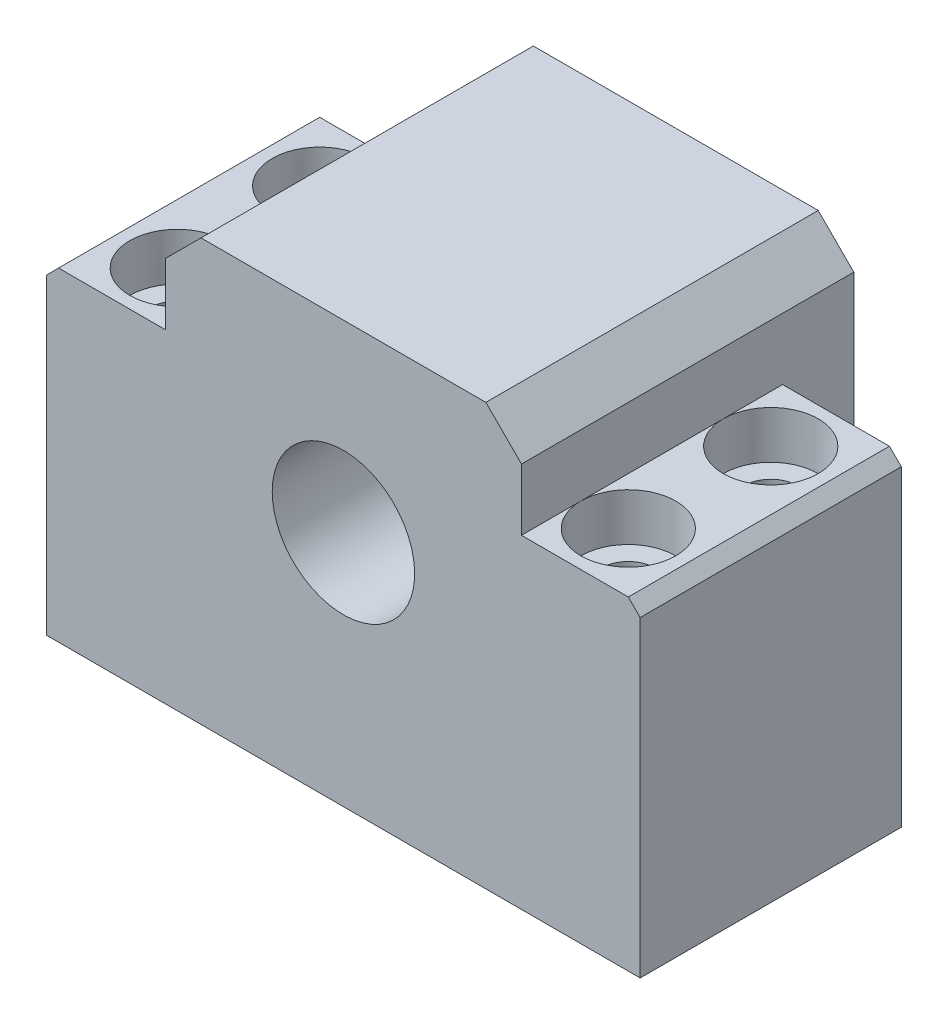
ISO-10303-21;
HEADER;
FILE_DESCRIPTION(('STEP AP214'),'2;1');
FILE_NAME('part.step','',(''),(''),'','','');
FILE_SCHEMA(('AUTOMOTIVE_DESIGN { 1 0 10303 214 1 1 1 1 }'));
ENDSEC;
DATA;
#1=APPLICATION_CONTEXT('core data for automotive mechanical design processes');
#2=APPLICATION_PROTOCOL_DEFINITION('international standard','automotive_design',2000,#1);
#3=PRODUCT_CONTEXT('',#1,'mechanical');
#4=PRODUCT('Part','Part','',(#3));
#5=PRODUCT_RELATED_PRODUCT_CATEGORY('part','',(#4));
#6=PRODUCT_DEFINITION_FORMATION('','',#4);
#7=PRODUCT_DEFINITION_CONTEXT('part definition',#1,'design');
#8=PRODUCT_DEFINITION('design','',#6,#7);
#9=PRODUCT_DEFINITION_SHAPE('','',#8);
#10=(LENGTH_UNIT() NAMED_UNIT(*) SI_UNIT(.MILLI.,.METRE.));
#11=(NAMED_UNIT(*) PLANE_ANGLE_UNIT() SI_UNIT($,.RADIAN.));
#12=(NAMED_UNIT(*) SI_UNIT($,.STERADIAN.) SOLID_ANGLE_UNIT());
#13=UNCERTAINTY_MEASURE_WITH_UNIT(LENGTH_MEASURE(1.E-05),#10,'distance_accuracy_value','');
#14=(GEOMETRIC_REPRESENTATION_CONTEXT(3) GLOBAL_UNCERTAINTY_ASSIGNED_CONTEXT((#13)) GLOBAL_UNIT_ASSIGNED_CONTEXT((#10,
#11,#12)) REPRESENTATION_CONTEXT('',''));
#15=CARTESIAN_POINT('',(0.,0.,0.));
#16=DIRECTION('',(0.,0.,1.));
#17=DIRECTION('',(1.,0.,0.));
#18=AXIS2_PLACEMENT_3D('',#15,#16,#17);
#19=CARTESIAN_POINT('',(0.,27.3,22.));
#20=DIRECTION('',(0.,-1.,0.));
#21=DIRECTION('',(0.,0.,-1.));
#22=AXIS2_PLACEMENT_3D('',#19,#20,#21);
#23=PLANE('',#22);
#24=DIRECTION('',(0.,0.,1.));
#25=VECTOR('',#24,1.);
#26=CARTESIAN_POINT('',(40.,27.3,22.));
#27=LINE('',#26,#25);
#28=CARTESIAN_POINT('',(40.,27.3,0.));
#29=VERTEX_POINT('',#28);
#30=CARTESIAN_POINT('',(40.,27.3,5.));
#31=VERTEX_POINT('',#30);
#32=EDGE_CURVE('E196',#29,#31,#27,.T.);
#33=ORIENTED_EDGE('',*,*,#32,.T.);
#34=CARTESIAN_POINT('',(44.,27.3,5.));
#35=DIRECTION('',(0.,1.,0.));
#36=DIRECTION('',(0.,0.,1.));
#37=AXIS2_PLACEMENT_3D('',#34,#35,#36);
#38=CIRCLE('',#37,4.);
#39=EDGE_CURVE('E54',#31,#31,#38,.T.);
#40=ORIENTED_EDGE('',*,*,#39,.F.);
#41=CARTESIAN_POINT('',(40.,27.3,17.));
#42=VERTEX_POINT('',#41);
#43=EDGE_CURVE('E60',#31,#42,#27,.T.);
#44=ORIENTED_EDGE('',*,*,#43,.T.);
#45=CARTESIAN_POINT('',(44.,27.3,17.));
#46=DIRECTION('',(0.,1.,0.));
#47=DIRECTION('',(0.,0.,1.));
#48=AXIS2_PLACEMENT_3D('',#45,#46,#47);
#49=CIRCLE('',#48,4.);
#50=EDGE_CURVE('E292',#42,#42,#49,.T.);
#51=ORIENTED_EDGE('',*,*,#50,.F.);
#52=CARTESIAN_POINT('',(40.,27.3,22.));
#53=VERTEX_POINT('',#52);
#54=EDGE_CURVE('E194',#42,#53,#27,.T.);
#55=ORIENTED_EDGE('',*,*,#54,.T.);
#56=DIRECTION('',(-1.,0.,0.));
#57=VECTOR('',#56,1.);
#58=CARTESIAN_POINT('',(0.,27.3,22.));
#59=LINE('',#58,#57);
#60=CARTESIAN_POINT('',(49.,27.3,22.));
#61=VERTEX_POINT('',#60);
#62=EDGE_CURVE('E214',#61,#53,#59,.T.);
#63=ORIENTED_EDGE('',*,*,#62,.F.);
#64=DIRECTION('',(0.,0.,-1.));
#65=VECTOR('',#64,1.);
#66=CARTESIAN_POINT('',(49.,27.3,22.));
#67=LINE('',#66,#65);
#68=CARTESIAN_POINT('',(49.,27.3,0.));
#69=VERTEX_POINT('',#68);
#70=EDGE_CURVE('E49',#61,#69,#67,.T.);
#71=ORIENTED_EDGE('',*,*,#70,.T.);
#72=DIRECTION('',(-1.,0.,0.));
#73=VECTOR('',#72,1.);
#74=CARTESIAN_POINT('',(0.,27.3,0.));
#75=LINE('',#74,#73);
#76=EDGE_CURVE('E208',#69,#29,#75,.T.);
#77=ORIENTED_EDGE('',*,*,#76,.T.);
#78=EDGE_LOOP('',(#33,#40,#44,#51,#55,#63,#71,#77));
#79=FACE_BOUND('',#78,.T.);
#80=ADVANCED_FACE('F41',(#79),#23,.F.);
#81=DIRECTION('',(0.,0.,-1.));
#82=VECTOR('',#81,1.);
#83=CARTESIAN_POINT('',(9.99999999999999,27.3,22.));
#84=LINE('',#83,#82);
#85=CARTESIAN_POINT('',(9.99999999999999,27.3,22.));
#86=VERTEX_POINT('',#85);
#87=CARTESIAN_POINT('',(9.99999999999999,27.3,17.));
#88=VERTEX_POINT('',#87);
#89=EDGE_CURVE('E200',#86,#88,#84,.T.);
#90=ORIENTED_EDGE('',*,*,#89,.T.);
#91=CARTESIAN_POINT('',(6.00000000000001,27.3,17.));
#92=DIRECTION('',(0.,1.,0.));
#93=DIRECTION('',(0.,0.,1.));
#94=AXIS2_PLACEMENT_3D('',#91,#92,#93);
#95=CIRCLE('',#94,3.99999999999999);
#96=EDGE_CURVE('E303',#88,#88,#95,.T.);
#97=ORIENTED_EDGE('',*,*,#96,.F.);
#98=CARTESIAN_POINT('',(9.99999999999999,27.3,5.));
#99=VERTEX_POINT('',#98);
#100=EDGE_CURVE('E204',#88,#99,#84,.T.);
#101=ORIENTED_EDGE('',*,*,#100,.T.);
#102=CARTESIAN_POINT('',(6.00000000000001,27.3,5.));
#103=DIRECTION('',(0.,1.,0.));
#104=DIRECTION('',(0.,0.,1.));
#105=AXIS2_PLACEMENT_3D('',#102,#103,#104);
#106=CIRCLE('',#105,3.99999999999999);
#107=EDGE_CURVE('E314',#99,#99,#106,.T.);
#108=ORIENTED_EDGE('',*,*,#107,.F.);
#109=CARTESIAN_POINT('',(9.99999999999999,27.3,0.));
#110=VERTEX_POINT('',#109);
#111=EDGE_CURVE('E199',#99,#110,#84,.T.);
#112=ORIENTED_EDGE('',*,*,#111,.T.);
#113=CARTESIAN_POINT('',(0.999999999999994,27.3,0.));
#114=VERTEX_POINT('',#113);
#115=EDGE_CURVE('E224',#110,#114,#75,.T.);
#116=ORIENTED_EDGE('',*,*,#115,.T.);
#117=DIRECTION('',(0.,0.,1.));
#118=VECTOR('',#117,1.);
#119=CARTESIAN_POINT('',(0.999999999999994,27.3,22.));
#120=LINE('',#119,#118);
#121=CARTESIAN_POINT('',(0.999999999999995,27.3,22.));
#122=VERTEX_POINT('',#121);
#123=EDGE_CURVE('E261',#114,#122,#120,.T.);
#124=ORIENTED_EDGE('',*,*,#123,.T.);
#125=EDGE_CURVE('E213',#86,#122,#59,.T.);
#126=ORIENTED_EDGE('',*,*,#125,.F.);
#127=EDGE_LOOP('',(#90,#97,#101,#108,#112,#116,#124,#126));
#128=FACE_BOUND('',#127,.T.);
#129=ADVANCED_FACE('F346',(#128),#23,.F.);
#130=CARTESIAN_POINT('',(0.,0.,22.));
#131=DIRECTION('',(1.,0.,0.));
#132=DIRECTION('',(0.,1.,0.));
#133=AXIS2_PLACEMENT_3D('',#130,#131,#132);
#134=PLANE('',#133);
#135=DIRECTION('',(0.,-1.,0.));
#136=VECTOR('',#135,1.);
#137=CARTESIAN_POINT('',(0.,0.,22.));
#138=LINE('',#137,#136);
#139=CARTESIAN_POINT('',(0.,26.3,22.));
#140=VERTEX_POINT('',#139);
#141=CARTESIAN_POINT('',(0.,0.,22.));
#142=VERTEX_POINT('',#141);
#143=EDGE_CURVE('E205',#140,#142,#138,.T.);
#144=ORIENTED_EDGE('',*,*,#143,.F.);
#145=DIRECTION('',(0.,0.,-1.));
#146=VECTOR('',#145,1.);
#147=CARTESIAN_POINT('',(0.,26.3,22.));
#148=LINE('',#147,#146);
#149=CARTESIAN_POINT('',(0.,26.3,0.));
#150=VERTEX_POINT('',#149);
#151=EDGE_CURVE('E254',#140,#150,#148,.T.);
#152=ORIENTED_EDGE('',*,*,#151,.T.);
#153=DIRECTION('',(0.,-1.,0.));
#154=VECTOR('',#153,1.);
#155=CARTESIAN_POINT('',(0.,0.,0.));
#156=LINE('',#155,#154);
#157=CARTESIAN_POINT('',(0.,0.,0.));
#158=VERTEX_POINT('',#157);
#159=EDGE_CURVE('E203',#150,#158,#156,.T.);
#160=ORIENTED_EDGE('',*,*,#159,.T.);
#161=DIRECTION('',(0.,0.,-1.));
#162=VECTOR('',#161,1.);
#163=CARTESIAN_POINT('',(0.,0.,22.));
#164=LINE('',#163,#162);
#165=EDGE_CURVE('E228',#142,#158,#164,.T.);
#166=ORIENTED_EDGE('',*,*,#165,.F.);
#167=EDGE_LOOP('',(#144,#152,#160,#166));
#168=FACE_BOUND('',#167,.T.);
#169=ADVANCED_FACE('F352',(#168),#134,.F.);
#170=CARTESIAN_POINT('',(0.,0.,22.));
#171=DIRECTION('',(0.,1.,0.));
#172=DIRECTION('',(0.,0.,1.));
#173=AXIS2_PLACEMENT_3D('',#170,#171,#172);
#174=PLANE('',#173);
#175=CARTESIAN_POINT('',(44.,0.,5.));
#176=DIRECTION('',(0.,1.,0.));
#177=DIRECTION('',(0.,0.,1.));
#178=AXIS2_PLACEMENT_3D('',#175,#176,#177);
#179=CIRCLE('',#178,2.25);
#180=CARTESIAN_POINT('',(44.,0.,7.24999999999999));
#181=VERTEX_POINT('',#180);
#182=EDGE_CURVE('E289',#181,#181,#179,.T.);
#183=ORIENTED_EDGE('',*,*,#182,.T.);
#184=EDGE_LOOP('',(#183));
#185=FACE_BOUND('',#184,.T.);
#186=CARTESIAN_POINT('',(44.,0.,17.));
#187=DIRECTION('',(0.,1.,0.));
#188=DIRECTION('',(0.,0.,1.));
#189=AXIS2_PLACEMENT_3D('',#186,#187,#188);
#190=CIRCLE('',#189,2.25);
#191=CARTESIAN_POINT('',(44.,0.,19.25));
#192=VERTEX_POINT('',#191);
#193=EDGE_CURVE('E300',#192,#192,#190,.T.);
#194=ORIENTED_EDGE('',*,*,#193,.T.);
#195=EDGE_LOOP('',(#194));
#196=FACE_BOUND('',#195,.T.);
#197=CARTESIAN_POINT('',(6.00000000000001,0.,17.));
#198=DIRECTION('',(0.,1.,0.));
#199=DIRECTION('',(0.,0.,1.));
#200=AXIS2_PLACEMENT_3D('',#197,#198,#199);
#201=CIRCLE('',#200,2.24999999999999);
#202=CARTESIAN_POINT('',(6.00000000000001,0.,19.25));
#203=VERTEX_POINT('',#202);
#204=EDGE_CURVE('E311',#203,#203,#201,.T.);
#205=ORIENTED_EDGE('',*,*,#204,.T.);
#206=EDGE_LOOP('',(#205));
#207=FACE_BOUND('',#206,.T.);
#208=CARTESIAN_POINT('',(6.00000000000001,0.,5.));
#209=DIRECTION('',(0.,1.,0.));
#210=DIRECTION('',(0.,0.,1.));
#211=AXIS2_PLACEMENT_3D('',#208,#209,#210);
#212=CIRCLE('',#211,2.24999999999999);
#213=CARTESIAN_POINT('',(6.00000000000001,0.,7.24999999999999));
#214=VERTEX_POINT('',#213);
#215=EDGE_CURVE('E323',#214,#214,#212,.T.);
#216=ORIENTED_EDGE('',*,*,#215,.T.);
#217=EDGE_LOOP('',(#216));
#218=FACE_BOUND('',#217,.T.);
#219=DIRECTION('',(1.,0.,0.));
#220=VECTOR('',#219,1.);
#221=CARTESIAN_POINT('',(0.,0.,0.));
#222=LINE('',#221,#220);
#223=CARTESIAN_POINT('',(50.,0.,0.));
#224=VERTEX_POINT('',#223);
#225=EDGE_CURVE('E219',#158,#224,#222,.T.);
#226=ORIENTED_EDGE('',*,*,#225,.T.);
#227=DIRECTION('',(0.,0.,-1.));
#228=VECTOR('',#227,1.);
#229=CARTESIAN_POINT('',(50.,0.,22.));
#230=LINE('',#229,#228);
#231=CARTESIAN_POINT('',(50.,0.,22.));
#232=VERTEX_POINT('',#231);
#233=EDGE_CURVE('E217',#232,#224,#230,.T.);
#234=ORIENTED_EDGE('',*,*,#233,.F.);
#235=DIRECTION('',(1.,0.,0.));
#236=VECTOR('',#235,1.);
#237=CARTESIAN_POINT('',(0.,0.,22.));
#238=LINE('',#237,#236);
#239=EDGE_CURVE('E207',#142,#232,#238,.T.);
#240=ORIENTED_EDGE('',*,*,#239,.F.);
#241=ORIENTED_EDGE('',*,*,#165,.T.);
#242=EDGE_LOOP('',(#226,#234,#240,#241));
#243=FACE_BOUND('',#242,.T.);
#244=ADVANCED_FACE('F361',(#185,#196,#207,#218,#243),#174,.F.);
#245=CARTESIAN_POINT('',(50.,0.,22.));
#246=DIRECTION('',(-1.,0.,0.));
#247=DIRECTION('',(0.,-1.,0.));
#248=AXIS2_PLACEMENT_3D('',#245,#246,#247);
#249=PLANE('',#248);
#250=DIRECTION('',(0.,1.,0.));
#251=VECTOR('',#250,1.);
#252=CARTESIAN_POINT('',(50.,0.,0.));
#253=LINE('',#252,#251);
#254=CARTESIAN_POINT('',(50.,26.3,0.));
#255=VERTEX_POINT('',#254);
#256=EDGE_CURVE('E221',#224,#255,#253,.T.);
#257=ORIENTED_EDGE('',*,*,#256,.T.);
#258=DIRECTION('',(0.,0.,1.));
#259=VECTOR('',#258,1.);
#260=CARTESIAN_POINT('',(50.,26.3,22.));
#261=LINE('',#260,#259);
#262=CARTESIAN_POINT('',(50.,26.3,22.));
#263=VERTEX_POINT('',#262);
#264=EDGE_CURVE('E11',#255,#263,#261,.T.);
#265=ORIENTED_EDGE('',*,*,#264,.T.);
#266=DIRECTION('',(0.,1.,0.));
#267=VECTOR('',#266,1.);
#268=CARTESIAN_POINT('',(50.,0.,22.));
#269=LINE('',#268,#267);
#270=EDGE_CURVE('E210',#232,#263,#269,.T.);
#271=ORIENTED_EDGE('',*,*,#270,.F.);
#272=ORIENTED_EDGE('',*,*,#233,.T.);
#273=EDGE_LOOP('',(#257,#265,#271,#272));
#274=FACE_BOUND('',#273,.T.);
#275=ADVANCED_FACE('F357',(#274),#249,.F.);
#276=CARTESIAN_POINT('',(0.,0.,22.));
#277=DIRECTION('',(0.,0.,-1.));
#278=DIRECTION('',(-1.,0.,0.));
#279=AXIS2_PLACEMENT_3D('',#276,#277,#278);
#280=PLANE('',#279);
#281=CARTESIAN_POINT('',(25.,20.,22.));
#282=DIRECTION('',(0.,0.,-1.));
#283=DIRECTION('',(-1.,0.,0.));
#284=AXIS2_PLACEMENT_3D('',#281,#282,#283);
#285=CIRCLE('',#284,6.);
#286=CARTESIAN_POINT('',(19.,20.,22.));
#287=VERTEX_POINT('',#286);
#288=EDGE_CURVE('E189',#287,#287,#285,.T.);
#289=ORIENTED_EDGE('',*,*,#288,.T.);
#290=EDGE_LOOP('',(#289));
#291=FACE_BOUND('',#290,.T.);
#292=ORIENTED_EDGE('',*,*,#125,.T.);
#293=DIRECTION('',(0.70710678118655,0.707106781186545,0.));
#294=VECTOR('',#293,1.);
#295=CARTESIAN_POINT('',(0.,26.3,22.));
#296=LINE('',#295,#294);
#297=EDGE_CURVE('E265',#122,#140,#296,.F.);
#298=ORIENTED_EDGE('',*,*,#297,.T.);
#299=ORIENTED_EDGE('',*,*,#143,.T.);
#300=ORIENTED_EDGE('',*,*,#239,.T.);
#301=ORIENTED_EDGE('',*,*,#270,.T.);
#302=DIRECTION('',(0.70710678118655,-0.707106781186545,0.));
#303=VECTOR('',#302,1.);
#304=CARTESIAN_POINT('',(49.,27.3,22.));
#305=LINE('',#304,#303);
#306=EDGE_CURVE('E263',#263,#61,#305,.F.);
#307=ORIENTED_EDGE('',*,*,#306,.T.);
#308=ORIENTED_EDGE('',*,*,#62,.T.);
#309=DIRECTION('',(0.,1.,0.));
#310=VECTOR('',#309,1.);
#311=CARTESIAN_POINT('',(40.,5.5,22.));
#312=LINE('',#311,#310);
#313=CARTESIAN_POINT('',(40.,32.5,22.));
#314=VERTEX_POINT('',#313);
#315=EDGE_CURVE('E188',#53,#314,#312,.T.);
#316=ORIENTED_EDGE('',*,*,#315,.T.);
#317=DIRECTION('',(0.707106781186549,-0.707106781186546,0.));
#318=VECTOR('',#317,1.);
#319=CARTESIAN_POINT('',(40.,32.5,22.));
#320=LINE('',#319,#318);
#321=CARTESIAN_POINT('',(37.,35.5,22.));
#322=VERTEX_POINT('',#321);
#323=EDGE_CURVE('E242',#314,#322,#320,.F.);
#324=ORIENTED_EDGE('',*,*,#323,.T.);
#325=DIRECTION('',(-1.,0.,0.));
#326=VECTOR('',#325,1.);
#327=CARTESIAN_POINT('',(9.99999999999999,35.5,22.));
#328=LINE('',#327,#326);
#329=CARTESIAN_POINT('',(13.,35.5,22.));
#330=VERTEX_POINT('',#329);
#331=EDGE_CURVE('E165',#322,#330,#328,.T.);
#332=ORIENTED_EDGE('',*,*,#331,.T.);
#333=DIRECTION('',(0.707106781186547,0.707106781186548,0.));
#334=VECTOR('',#333,1.);
#335=CARTESIAN_POINT('',(13.,35.5,22.));
#336=LINE('',#335,#334);
#337=CARTESIAN_POINT('',(9.99999999999999,32.5,22.));
#338=VERTEX_POINT('',#337);
#339=EDGE_CURVE('E244',#330,#338,#336,.F.);
#340=ORIENTED_EDGE('',*,*,#339,.T.);
#341=DIRECTION('',(0.,-1.,0.));
#342=VECTOR('',#341,1.);
#343=CARTESIAN_POINT('',(9.99999999999999,5.5,22.));
#344=LINE('',#343,#342);
#345=EDGE_CURVE('E186',#338,#86,#344,.T.);
#346=ORIENTED_EDGE('',*,*,#345,.T.);
#347=EDGE_LOOP('',(#292,#298,#299,#300,#301,#307,#308,#316,#324,#332,#340,#346));
#348=FACE_BOUND('',#347,.T.);
#349=ADVANCED_FACE('F360',(#291,#348),#280,.F.);
#350=CARTESIAN_POINT('',(0.,0.,0.));
#351=DIRECTION('',(0.,0.,-1.));
#352=DIRECTION('',(-1.,0.,0.));
#353=AXIS2_PLACEMENT_3D('',#350,#351,#352);
#354=PLANE('',#353);
#355=ORIENTED_EDGE('',*,*,#159,.F.);
#356=DIRECTION('',(-0.70710678118655,-0.707106781186545,0.));
#357=VECTOR('',#356,1.);
#358=CARTESIAN_POINT('',(-13.15,13.1500000000001,0.));
#359=LINE('',#358,#357);
#360=EDGE_CURVE('E259',#150,#114,#359,.F.);
#361=ORIENTED_EDGE('',*,*,#360,.T.);
#362=ORIENTED_EDGE('',*,*,#115,.F.);
#363=DIRECTION('',(0.,1.,0.));
#364=VECTOR('',#363,1.);
#365=CARTESIAN_POINT('',(9.99999999999999,0.,0.));
#366=LINE('',#365,#364);
#367=CARTESIAN_POINT('',(9.99999999999999,5.5,0.));
#368=VERTEX_POINT('',#367);
#369=EDGE_CURVE('E235',#368,#110,#366,.T.);
#370=ORIENTED_EDGE('',*,*,#369,.F.);
#371=DIRECTION('',(-1.,0.,0.));
#372=VECTOR('',#371,1.);
#373=CARTESIAN_POINT('',(0.,5.5,0.));
#374=LINE('',#373,#372);
#375=CARTESIAN_POINT('',(40.,5.5,0.));
#376=VERTEX_POINT('',#375);
#377=EDGE_CURVE('E172',#376,#368,#374,.T.);
#378=ORIENTED_EDGE('',*,*,#377,.F.);
#379=DIRECTION('',(0.,-1.,0.));
#380=VECTOR('',#379,1.);
#381=CARTESIAN_POINT('',(40.,0.,0.));
#382=LINE('',#381,#380);
#383=EDGE_CURVE('E232',#29,#376,#382,.T.);
#384=ORIENTED_EDGE('',*,*,#383,.F.);
#385=ORIENTED_EDGE('',*,*,#76,.F.);
#386=DIRECTION('',(-0.70710678118655,0.707106781186545,0.));
#387=VECTOR('',#386,1.);
#388=CARTESIAN_POINT('',(38.1499999999998,38.1500000000001,0.));
#389=LINE('',#388,#387);
#390=EDGE_CURVE('E257',#69,#255,#389,.F.);
#391=ORIENTED_EDGE('',*,*,#390,.T.);
#392=ORIENTED_EDGE('',*,*,#256,.F.);
#393=ORIENTED_EDGE('',*,*,#225,.F.);
#394=EDGE_LOOP('',(#355,#361,#362,#370,#378,#384,#385,#391,#392,#393));
#395=FACE_BOUND('',#394,.T.);
#396=ADVANCED_FACE('F275',(#395),#354,.T.);
#397=CARTESIAN_POINT('',(9.99999999999999,5.5,-6.));
#398=DIRECTION('',(-1.,0.,0.));
#399=DIRECTION('',(0.,0.,1.));
#400=AXIS2_PLACEMENT_3D('',#397,#398,#399);
#401=PLANE('',#400);
#402=ORIENTED_EDGE('',*,*,#345,.F.);
#403=DIRECTION('',(0.,0.,-1.));
#404=VECTOR('',#403,1.);
#405=CARTESIAN_POINT('',(9.99999999999999,32.5,-6.));
#406=LINE('',#405,#404);
#407=CARTESIAN_POINT('',(9.99999999999999,32.5,-6.));
#408=VERTEX_POINT('',#407);
#409=EDGE_CURVE('E160',#338,#408,#406,.T.);
#410=ORIENTED_EDGE('',*,*,#409,.T.);
#411=DIRECTION('',(0.,-1.,0.));
#412=VECTOR('',#411,1.);
#413=CARTESIAN_POINT('',(9.99999999999999,5.5,-6.));
#414=LINE('',#413,#412);
#415=CARTESIAN_POINT('',(9.99999999999999,5.5,-6.));
#416=VERTEX_POINT('',#415);
#417=EDGE_CURVE('E153',#408,#416,#414,.T.);
#418=ORIENTED_EDGE('',*,*,#417,.T.);
#419=DIRECTION('',(0.,0.,1.));
#420=VECTOR('',#419,1.);
#421=CARTESIAN_POINT('',(9.99999999999999,5.5,-6.));
#422=LINE('',#421,#420);
#423=EDGE_CURVE('E158',#416,#368,#422,.T.);
#424=ORIENTED_EDGE('',*,*,#423,.T.);
#425=ORIENTED_EDGE('',*,*,#369,.T.);
#426=ORIENTED_EDGE('',*,*,#111,.F.);
#427=ORIENTED_EDGE('',*,*,#100,.F.);
#428=ORIENTED_EDGE('',*,*,#89,.F.);
#429=EDGE_LOOP('',(#402,#410,#418,#424,#425,#426,#427,#428));
#430=FACE_BOUND('',#429,.T.);
#431=ADVANCED_FACE('F156',(#430),#401,.T.);
#432=CARTESIAN_POINT('',(40.,5.5,-6.));
#433=DIRECTION('',(1.,0.,0.));
#434=DIRECTION('',(0.,0.,-1.));
#435=AXIS2_PLACEMENT_3D('',#432,#433,#434);
#436=PLANE('',#435);
#437=DIRECTION('',(0.,1.,0.));
#438=VECTOR('',#437,1.);
#439=CARTESIAN_POINT('',(40.,5.5,-6.));
#440=LINE('',#439,#438);
#441=CARTESIAN_POINT('',(40.,5.5,-6.));
#442=VERTEX_POINT('',#441);
#443=CARTESIAN_POINT('',(40.,32.5,-6.));
#444=VERTEX_POINT('',#443);
#445=EDGE_CURVE('E179',#442,#444,#440,.T.);
#446=ORIENTED_EDGE('',*,*,#445,.T.);
#447=DIRECTION('',(0.,0.,1.));
#448=VECTOR('',#447,1.);
#449=CARTESIAN_POINT('',(40.,32.5,-6.));
#450=LINE('',#449,#448);
#451=EDGE_CURVE('E251',#444,#314,#450,.T.);
#452=ORIENTED_EDGE('',*,*,#451,.T.);
#453=ORIENTED_EDGE('',*,*,#315,.F.);
#454=ORIENTED_EDGE('',*,*,#54,.F.);
#455=ORIENTED_EDGE('',*,*,#43,.F.);
#456=ORIENTED_EDGE('',*,*,#32,.F.);
#457=ORIENTED_EDGE('',*,*,#383,.T.);
#458=DIRECTION('',(0.,0.,1.));
#459=VECTOR('',#458,1.);
#460=CARTESIAN_POINT('',(40.,5.5,-6.));
#461=LINE('',#460,#459);
#462=EDGE_CURVE('E173',#442,#376,#461,.T.);
#463=ORIENTED_EDGE('',*,*,#462,.F.);
#464=EDGE_LOOP('',(#446,#452,#453,#454,#455,#456,#457,#463));
#465=FACE_BOUND('',#464,.T.);
#466=ADVANCED_FACE('F279',(#465),#436,.T.);
#467=CARTESIAN_POINT('',(9.99999999999999,35.5,-6.));
#468=DIRECTION('',(0.,1.,0.));
#469=DIRECTION('',(0.,0.,1.));
#470=AXIS2_PLACEMENT_3D('',#467,#468,#469);
#471=PLANE('',#470);
#472=DIRECTION('',(-1.,0.,0.));
#473=VECTOR('',#472,1.);
#474=CARTESIAN_POINT('',(9.99999999999999,35.5,-6.));
#475=LINE('',#474,#473);
#476=CARTESIAN_POINT('',(37.,35.5,-6.));
#477=VERTEX_POINT('',#476);
#478=CARTESIAN_POINT('',(13.,35.5,-6.));
#479=VERTEX_POINT('',#478);
#480=EDGE_CURVE('E174',#477,#479,#475,.T.);
#481=ORIENTED_EDGE('',*,*,#480,.T.);
#482=DIRECTION('',(0.,0.,1.));
#483=VECTOR('',#482,1.);
#484=CARTESIAN_POINT('',(13.,35.5,-6.));
#485=LINE('',#484,#483);
#486=EDGE_CURVE('E239',#479,#330,#485,.T.);
#487=ORIENTED_EDGE('',*,*,#486,.T.);
#488=ORIENTED_EDGE('',*,*,#331,.F.);
#489=DIRECTION('',(0.,0.,-1.));
#490=VECTOR('',#489,1.);
#491=CARTESIAN_POINT('',(37.,35.5,-6.));
#492=LINE('',#491,#490);
#493=EDGE_CURVE('E237',#322,#477,#492,.T.);
#494=ORIENTED_EDGE('',*,*,#493,.T.);
#495=EDGE_LOOP('',(#481,#487,#488,#494));
#496=FACE_BOUND('',#495,.T.);
#497=ADVANCED_FACE('F342',(#496),#471,.T.);
#498=CARTESIAN_POINT('',(9.99999999999999,5.5,-6.));
#499=DIRECTION('',(0.,-1.,0.));
#500=DIRECTION('',(0.,0.,-1.));
#501=AXIS2_PLACEMENT_3D('',#498,#499,#500);
#502=PLANE('',#501);
#503=ORIENTED_EDGE('',*,*,#462,.T.);
#504=ORIENTED_EDGE('',*,*,#377,.T.);
#505=ORIENTED_EDGE('',*,*,#423,.F.);
#506=DIRECTION('',(1.,0.,0.));
#507=VECTOR('',#506,1.);
#508=CARTESIAN_POINT('',(9.99999999999999,5.5,-6.));
#509=LINE('',#508,#507);
#510=EDGE_CURVE('E164',#416,#442,#509,.T.);
#511=ORIENTED_EDGE('',*,*,#510,.T.);
#512=EDGE_LOOP('',(#503,#504,#505,#511));
#513=FACE_BOUND('',#512,.T.);
#514=ADVANCED_FACE('F171',(#513),#502,.T.);
#515=CARTESIAN_POINT('',(0.,0.,-6.));
#516=DIRECTION('',(0.,0.,-1.));
#517=DIRECTION('',(-1.,0.,0.));
#518=AXIS2_PLACEMENT_3D('',#515,#516,#517);
#519=PLANE('',#518);
#520=CARTESIAN_POINT('',(25.,20.,-6.));
#521=DIRECTION('',(0.,0.,-1.));
#522=DIRECTION('',(-1.,0.,0.));
#523=AXIS2_PLACEMENT_3D('',#520,#521,#522);
#524=CIRCLE('',#523,6.);
#525=CARTESIAN_POINT('',(19.,20.,-6.));
#526=VERTEX_POINT('',#525);
#527=EDGE_CURVE('E326',#526,#526,#524,.T.);
#528=ORIENTED_EDGE('',*,*,#527,.F.);
#529=EDGE_LOOP('',(#528));
#530=FACE_BOUND('',#529,.T.);
#531=ORIENTED_EDGE('',*,*,#417,.F.);
#532=DIRECTION('',(-0.707106781186547,-0.707106781186548,0.));
#533=VECTOR('',#532,1.);
#534=CARTESIAN_POINT('',(-11.25,11.25,-6.));
#535=LINE('',#534,#533);
#536=EDGE_CURVE('E249',#408,#479,#535,.F.);
#537=ORIENTED_EDGE('',*,*,#536,.T.);
#538=ORIENTED_EDGE('',*,*,#480,.F.);
#539=DIRECTION('',(-0.707106781186549,0.707106781186546,0.));
#540=VECTOR('',#539,1.);
#541=CARTESIAN_POINT('',(36.2499999999999,36.2500000000001,-6.));
#542=LINE('',#541,#540);
#543=EDGE_CURVE('E247',#477,#444,#542,.F.);
#544=ORIENTED_EDGE('',*,*,#543,.T.);
#545=ORIENTED_EDGE('',*,*,#445,.F.);
#546=ORIENTED_EDGE('',*,*,#510,.F.);
#547=EDGE_LOOP('',(#531,#537,#538,#544,#545,#546));
#548=FACE_BOUND('',#547,.T.);
#549=ADVANCED_FACE('F177',(#530,#548),#519,.T.);
#550=CARTESIAN_POINT('',(25.,20.,22.));
#551=DIRECTION('',(0.,0.,-1.));
#552=DIRECTION('',(-1.,0.,0.));
#553=AXIS2_PLACEMENT_3D('',#550,#551,#552);
#554=CYLINDRICAL_SURFACE('',#553,6.);
#555=ORIENTED_EDGE('',*,*,#288,.F.);
#556=EDGE_LOOP('',(#555));
#557=FACE_BOUND('',#556,.T.);
#558=ORIENTED_EDGE('',*,*,#527,.T.);
#559=EDGE_LOOP('',(#558));
#560=FACE_BOUND('',#559,.T.);
#561=ADVANCED_FACE('F331',(#557,#560),#554,.F.);
#562=CARTESIAN_POINT('',(13.,35.5,-6.));
#563=DIRECTION('',(0.707106781186548,-0.707106781186547,0.));
#564=DIRECTION('',(0.,0.,1.));
#565=AXIS2_PLACEMENT_3D('',#562,#563,#564);
#566=PLANE('',#565);
#567=ORIENTED_EDGE('',*,*,#536,.F.);
#568=ORIENTED_EDGE('',*,*,#409,.F.);
#569=ORIENTED_EDGE('',*,*,#339,.F.);
#570=ORIENTED_EDGE('',*,*,#486,.F.);
#571=EDGE_LOOP('',(#567,#568,#569,#570));
#572=FACE_BOUND('',#571,.T.);
#573=ADVANCED_FACE('F339',(#572),#566,.F.);
#574=CARTESIAN_POINT('',(40.,32.5,-6.));
#575=DIRECTION('',(-0.707106781186546,-0.707106781186549,0.));
#576=DIRECTION('',(0.,0.,1.));
#577=AXIS2_PLACEMENT_3D('',#574,#575,#576);
#578=PLANE('',#577);
#579=ORIENTED_EDGE('',*,*,#543,.F.);
#580=ORIENTED_EDGE('',*,*,#493,.F.);
#581=ORIENTED_EDGE('',*,*,#323,.F.);
#582=ORIENTED_EDGE('',*,*,#451,.F.);
#583=EDGE_LOOP('',(#579,#580,#581,#582));
#584=FACE_BOUND('',#583,.T.);
#585=ADVANCED_FACE('F371',(#584),#578,.F.);
#586=CARTESIAN_POINT('',(0.,26.3,22.));
#587=DIRECTION('',(0.707106781186545,-0.70710678118655,0.));
#588=DIRECTION('',(0.,0.,-1.));
#589=AXIS2_PLACEMENT_3D('',#586,#587,#588);
#590=PLANE('',#589);
#591=ORIENTED_EDGE('',*,*,#297,.F.);
#592=ORIENTED_EDGE('',*,*,#123,.F.);
#593=ORIENTED_EDGE('',*,*,#360,.F.);
#594=ORIENTED_EDGE('',*,*,#151,.F.);
#595=EDGE_LOOP('',(#591,#592,#593,#594));
#596=FACE_BOUND('',#595,.T.);
#597=ADVANCED_FACE('F374',(#596),#590,.F.);
#598=CARTESIAN_POINT('',(49.,27.3,22.));
#599=DIRECTION('',(-0.707106781186545,-0.70710678118655,0.));
#600=DIRECTION('',(0.,0.,-1.));
#601=AXIS2_PLACEMENT_3D('',#598,#599,#600);
#602=PLANE('',#601);
#603=ORIENTED_EDGE('',*,*,#306,.F.);
#604=ORIENTED_EDGE('',*,*,#264,.F.);
#605=ORIENTED_EDGE('',*,*,#390,.F.);
#606=ORIENTED_EDGE('',*,*,#70,.F.);
#607=EDGE_LOOP('',(#603,#604,#605,#606));
#608=FACE_BOUND('',#607,.T.);
#609=ADVANCED_FACE('F43',(#608),#602,.F.);
#610=CARTESIAN_POINT('',(6.00000000000001,27.3,5.));
#611=DIRECTION('',(0.,1.,0.));
#612=DIRECTION('',(0.,0.,1.));
#613=AXIS2_PLACEMENT_3D('',#610,#611,#612);
#614=CYLINDRICAL_SURFACE('',#613,2.25);
#615=ORIENTED_EDGE('',*,*,#215,.F.);
#616=EDGE_LOOP('',(#615));
#617=FACE_BOUND('',#616,.T.);
#618=CARTESIAN_POINT('',(6.00000000000001,23.3,5.));
#619=DIRECTION('',(0.,1.,0.));
#620=DIRECTION('',(0.,0.,1.));
#621=AXIS2_PLACEMENT_3D('',#618,#619,#620);
#622=CIRCLE('',#621,2.25000000000001);
#623=CARTESIAN_POINT('',(6.00000000000001,23.3,7.25000000000001));
#624=VERTEX_POINT('',#623);
#625=EDGE_CURVE('E320',#624,#624,#622,.T.);
#626=ORIENTED_EDGE('',*,*,#625,.T.);
#627=EDGE_LOOP('',(#626));
#628=FACE_BOUND('',#627,.T.);
#629=ADVANCED_FACE('F381',(#617,#628),#614,.F.);
#630=CARTESIAN_POINT('',(8.25000000000002,23.3,5.));
#631=DIRECTION('',(0.,-1.,0.));
#632=DIRECTION('',(0.,0.,-1.));
#633=AXIS2_PLACEMENT_3D('',#630,#631,#632);
#634=PLANE('',#633);
#635=ORIENTED_EDGE('',*,*,#625,.F.);
#636=EDGE_LOOP('',(#635));
#637=FACE_BOUND('',#636,.T.);
#638=CARTESIAN_POINT('',(6.00000000000001,23.3,5.));
#639=DIRECTION('',(0.,1.,0.));
#640=DIRECTION('',(0.,0.,1.));
#641=AXIS2_PLACEMENT_3D('',#638,#639,#640);
#642=CIRCLE('',#641,3.99999999999999);
#643=CARTESIAN_POINT('',(6.00000000000001,23.3,8.99999999999999));
#644=VERTEX_POINT('',#643);
#645=EDGE_CURVE('E317',#644,#644,#642,.T.);
#646=ORIENTED_EDGE('',*,*,#645,.T.);
#647=EDGE_LOOP('',(#646));
#648=FACE_BOUND('',#647,.T.);
#649=ADVANCED_FACE('F407',(#637,#648),#634,.F.);
#650=CARTESIAN_POINT('',(6.00000000000001,27.3,5.));
#651=DIRECTION('',(0.,1.,0.));
#652=DIRECTION('',(0.,0.,1.));
#653=AXIS2_PLACEMENT_3D('',#650,#651,#652);
#654=CYLINDRICAL_SURFACE('',#653,3.99999999999999);
#655=ORIENTED_EDGE('',*,*,#645,.F.);
#656=EDGE_LOOP('',(#655));
#657=FACE_BOUND('',#656,.T.);
#658=ORIENTED_EDGE('',*,*,#107,.T.);
#659=EDGE_LOOP('',(#658));
#660=FACE_BOUND('',#659,.T.);
#661=ADVANCED_FACE('F404',(#657,#660),#654,.F.);
#662=CARTESIAN_POINT('',(6.00000000000001,27.3,17.));
#663=DIRECTION('',(0.,1.,0.));
#664=DIRECTION('',(0.,0.,1.));
#665=AXIS2_PLACEMENT_3D('',#662,#663,#664);
#666=CYLINDRICAL_SURFACE('',#665,2.25);
#667=ORIENTED_EDGE('',*,*,#204,.F.);
#668=EDGE_LOOP('',(#667));
#669=FACE_BOUND('',#668,.T.);
#670=CARTESIAN_POINT('',(6.00000000000001,23.3,17.));
#671=DIRECTION('',(0.,1.,0.));
#672=DIRECTION('',(0.,0.,1.));
#673=AXIS2_PLACEMENT_3D('',#670,#671,#672);
#674=CIRCLE('',#673,2.25000000000001);
#675=CARTESIAN_POINT('',(6.00000000000001,23.3,19.25));
#676=VERTEX_POINT('',#675);
#677=EDGE_CURVE('E308',#676,#676,#674,.T.);
#678=ORIENTED_EDGE('',*,*,#677,.T.);
#679=EDGE_LOOP('',(#678));
#680=FACE_BOUND('',#679,.T.);
#681=ADVANCED_FACE('F406',(#669,#680),#666,.F.);
#682=CARTESIAN_POINT('',(8.25000000000002,23.3,17.));
#683=DIRECTION('',(0.,-1.,0.));
#684=DIRECTION('',(0.,0.,-1.));
#685=AXIS2_PLACEMENT_3D('',#682,#683,#684);
#686=PLANE('',#685);
#687=ORIENTED_EDGE('',*,*,#677,.F.);
#688=EDGE_LOOP('',(#687));
#689=FACE_BOUND('',#688,.T.);
#690=CARTESIAN_POINT('',(6.00000000000001,23.3,17.));
#691=DIRECTION('',(0.,1.,0.));
#692=DIRECTION('',(0.,0.,1.));
#693=AXIS2_PLACEMENT_3D('',#690,#691,#692);
#694=CIRCLE('',#693,3.99999999999999);
#695=CARTESIAN_POINT('',(6.00000000000001,23.3,21.));
#696=VERTEX_POINT('',#695);
#697=EDGE_CURVE('E305',#696,#696,#694,.T.);
#698=ORIENTED_EDGE('',*,*,#697,.T.);
#699=EDGE_LOOP('',(#698));
#700=FACE_BOUND('',#699,.T.);
#701=ADVANCED_FACE('F414',(#689,#700),#686,.F.);
#702=CARTESIAN_POINT('',(6.00000000000001,27.3,17.));
#703=DIRECTION('',(0.,1.,0.));
#704=DIRECTION('',(0.,0.,1.));
#705=AXIS2_PLACEMENT_3D('',#702,#703,#704);
#706=CYLINDRICAL_SURFACE('',#705,3.99999999999999);
#707=ORIENTED_EDGE('',*,*,#697,.F.);
#708=EDGE_LOOP('',(#707));
#709=FACE_BOUND('',#708,.T.);
#710=ORIENTED_EDGE('',*,*,#96,.T.);
#711=EDGE_LOOP('',(#710));
#712=FACE_BOUND('',#711,.T.);
#713=ADVANCED_FACE('F457',(#709,#712),#706,.F.);
#714=CARTESIAN_POINT('',(44.,27.3,17.));
#715=DIRECTION('',(0.,1.,0.));
#716=DIRECTION('',(0.,0.,1.));
#717=AXIS2_PLACEMENT_3D('',#714,#715,#716);
#718=CYLINDRICAL_SURFACE('',#717,2.25);
#719=ORIENTED_EDGE('',*,*,#193,.F.);
#720=EDGE_LOOP('',(#719));
#721=FACE_BOUND('',#720,.T.);
#722=CARTESIAN_POINT('',(44.,23.3,17.));
#723=DIRECTION('',(0.,1.,0.));
#724=DIRECTION('',(0.,0.,1.));
#725=AXIS2_PLACEMENT_3D('',#722,#723,#724);
#726=CIRCLE('',#725,2.25000000000001);
#727=CARTESIAN_POINT('',(44.,23.3,19.25));
#728=VERTEX_POINT('',#727);
#729=EDGE_CURVE('E297',#728,#728,#726,.T.);
#730=ORIENTED_EDGE('',*,*,#729,.T.);
#731=EDGE_LOOP('',(#730));
#732=FACE_BOUND('',#731,.T.);
#733=ADVANCED_FACE('F466',(#721,#732),#718,.F.);
#734=CARTESIAN_POINT('',(46.25,23.3,17.));
#735=DIRECTION('',(0.,-1.,0.));
#736=DIRECTION('',(0.,0.,-1.));
#737=AXIS2_PLACEMENT_3D('',#734,#735,#736);
#738=PLANE('',#737);
#739=ORIENTED_EDGE('',*,*,#729,.F.);
#740=EDGE_LOOP('',(#739));
#741=FACE_BOUND('',#740,.T.);
#742=CARTESIAN_POINT('',(44.,23.3,17.));
#743=DIRECTION('',(0.,1.,0.));
#744=DIRECTION('',(0.,0.,1.));
#745=AXIS2_PLACEMENT_3D('',#742,#743,#744);
#746=CIRCLE('',#745,4.);
#747=CARTESIAN_POINT('',(44.,23.3,21.));
#748=VERTEX_POINT('',#747);
#749=EDGE_CURVE('E294',#748,#748,#746,.T.);
#750=ORIENTED_EDGE('',*,*,#749,.T.);
#751=EDGE_LOOP('',(#750));
#752=FACE_BOUND('',#751,.T.);
#753=ADVANCED_FACE('F476',(#741,#752),#738,.F.);
#754=CARTESIAN_POINT('',(44.,27.3,17.));
#755=DIRECTION('',(0.,1.,0.));
#756=DIRECTION('',(0.,0.,1.));
#757=AXIS2_PLACEMENT_3D('',#754,#755,#756);
#758=CYLINDRICAL_SURFACE('',#757,4.);
#759=ORIENTED_EDGE('',*,*,#749,.F.);
#760=EDGE_LOOP('',(#759));
#761=FACE_BOUND('',#760,.T.);
#762=ORIENTED_EDGE('',*,*,#50,.T.);
#763=EDGE_LOOP('',(#762));
#764=FACE_BOUND('',#763,.T.);
#765=ADVANCED_FACE('F486',(#761,#764),#758,.F.);
#766=CARTESIAN_POINT('',(44.,27.3,5.));
#767=DIRECTION('',(0.,1.,0.));
#768=DIRECTION('',(0.,0.,1.));
#769=AXIS2_PLACEMENT_3D('',#766,#767,#768);
#770=CYLINDRICAL_SURFACE('',#769,2.25);
#771=ORIENTED_EDGE('',*,*,#182,.F.);
#772=EDGE_LOOP('',(#771));
#773=FACE_BOUND('',#772,.T.);
#774=CARTESIAN_POINT('',(44.,23.3,5.));
#775=DIRECTION('',(0.,1.,0.));
#776=DIRECTION('',(0.,0.,1.));
#777=AXIS2_PLACEMENT_3D('',#774,#775,#776);
#778=CIRCLE('',#777,2.25000000000001);
#779=CARTESIAN_POINT('',(44.,23.3,7.25000000000001));
#780=VERTEX_POINT('',#779);
#781=EDGE_CURVE('E284',#780,#780,#778,.T.);
#782=ORIENTED_EDGE('',*,*,#781,.T.);
#783=EDGE_LOOP('',(#782));
#784=FACE_BOUND('',#783,.T.);
#785=ADVANCED_FACE('F496',(#773,#784),#770,.F.);
#786=CARTESIAN_POINT('',(46.25,23.3,5.));
#787=DIRECTION('',(0.,-1.,0.));
#788=DIRECTION('',(0.,0.,-1.));
#789=AXIS2_PLACEMENT_3D('',#786,#787,#788);
#790=PLANE('',#789);
#791=ORIENTED_EDGE('',*,*,#781,.F.);
#792=EDGE_LOOP('',(#791));
#793=FACE_BOUND('',#792,.T.);
#794=CARTESIAN_POINT('',(44.,23.3,5.));
#795=DIRECTION('',(0.,1.,0.));
#796=DIRECTION('',(0.,0.,1.));
#797=AXIS2_PLACEMENT_3D('',#794,#795,#796);
#798=CIRCLE('',#797,4.);
#799=CARTESIAN_POINT('',(44.,23.3,8.99999999999999));
#800=VERTEX_POINT('',#799);
#801=EDGE_CURVE('E281',#800,#800,#798,.T.);
#802=ORIENTED_EDGE('',*,*,#801,.T.);
#803=EDGE_LOOP('',(#802));
#804=FACE_BOUND('',#803,.T.);
#805=ADVANCED_FACE('F506',(#793,#804),#790,.F.);
#806=CARTESIAN_POINT('',(44.,27.3,5.));
#807=DIRECTION('',(0.,1.,0.));
#808=DIRECTION('',(0.,0.,1.));
#809=AXIS2_PLACEMENT_3D('',#806,#807,#808);
#810=CYLINDRICAL_SURFACE('',#809,4.);
#811=ORIENTED_EDGE('',*,*,#801,.F.);
#812=EDGE_LOOP('',(#811));
#813=FACE_BOUND('',#812,.T.);
#814=ORIENTED_EDGE('',*,*,#39,.T.);
#815=EDGE_LOOP('',(#814));
#816=FACE_BOUND('',#815,.T.);
#817=ADVANCED_FACE('F516',(#813,#816),#810,.F.);
#818=CLOSED_SHELL('',(#80,#129,#169,#244,#275,#349,#396,#431,#466,#497,#514,#549,#561,#573,#585,
#597,#609,#629,#649,#661,#681,#701,#713,#733,#753,#765,#785,#805,#817));
#819=MANIFOLD_SOLID_BREP('B2',#818);
#820=ADVANCED_BREP_SHAPE_REPRESENTATION('',(#18,#819),#14);
#821=SHAPE_DEFINITION_REPRESENTATION(#9,#820);
ENDSEC;
END-ISO-10303-21;
